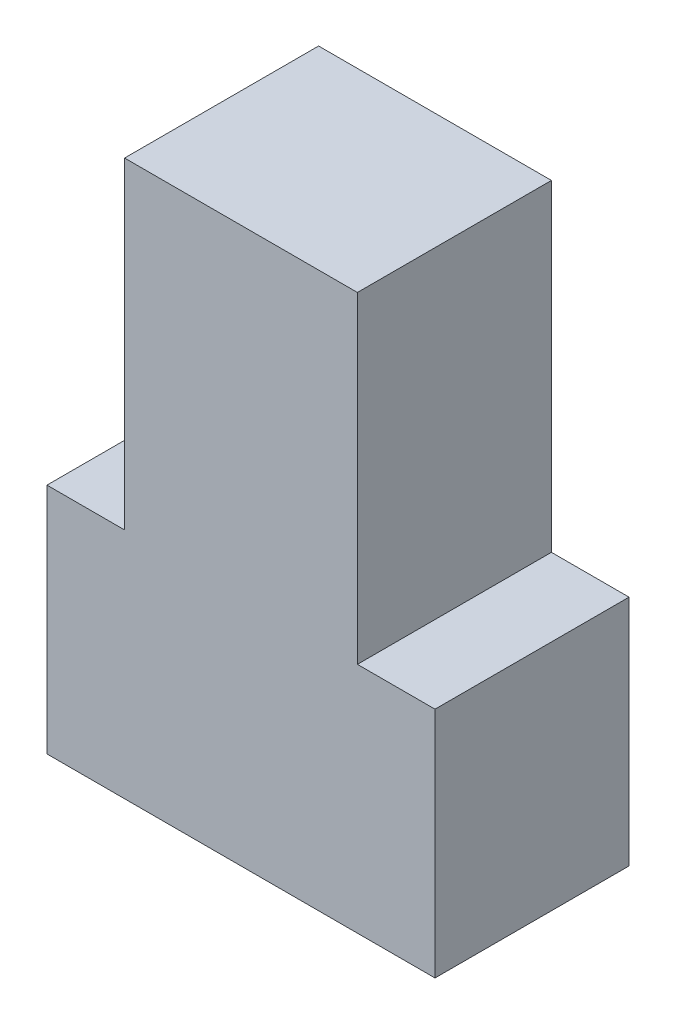
ISO-10303-21;
HEADER;
FILE_DESCRIPTION(('STEP AP214'),'2;1');
FILE_NAME('part.step','',(''),(''),'','','');
FILE_SCHEMA(('AUTOMOTIVE_DESIGN { 1 0 10303 214 1 1 1 1 }'));
ENDSEC;
DATA;
#1=APPLICATION_CONTEXT('core data for automotive mechanical design processes');
#2=APPLICATION_PROTOCOL_DEFINITION('international standard','automotive_design',2000,#1);
#3=PRODUCT_CONTEXT('',#1,'mechanical');
#4=PRODUCT('Part','Part','',(#3));
#5=PRODUCT_RELATED_PRODUCT_CATEGORY('part','',(#4));
#6=PRODUCT_DEFINITION_FORMATION('','',#4);
#7=PRODUCT_DEFINITION_CONTEXT('part definition',#1,'design');
#8=PRODUCT_DEFINITION('design','',#6,#7);
#9=PRODUCT_DEFINITION_SHAPE('','',#8);
#10=(LENGTH_UNIT() NAMED_UNIT(*) SI_UNIT(.MILLI.,.METRE.));
#11=(NAMED_UNIT(*) PLANE_ANGLE_UNIT() SI_UNIT($,.RADIAN.));
#12=(NAMED_UNIT(*) SI_UNIT($,.STERADIAN.) SOLID_ANGLE_UNIT());
#13=UNCERTAINTY_MEASURE_WITH_UNIT(LENGTH_MEASURE(1.E-05),#10,'distance_accuracy_value','');
#14=(GEOMETRIC_REPRESENTATION_CONTEXT(3) GLOBAL_UNCERTAINTY_ASSIGNED_CONTEXT((#13)) GLOBAL_UNIT_ASSIGNED_CONTEXT((#10,
#11,#12)) REPRESENTATION_CONTEXT('',''));
#15=CARTESIAN_POINT('',(0.,0.,0.));
#16=DIRECTION('',(0.,0.,1.));
#17=DIRECTION('',(1.,0.,0.));
#18=AXIS2_PLACEMENT_3D('',#15,#16,#17);
#19=CARTESIAN_POINT('',(-0.00029960835417188,20.4586796564352,-0.01));
#20=DIRECTION('',(0.,-1.,0.));
#21=DIRECTION('',(0.,0.,-1.));
#22=AXIS2_PLACEMENT_3D('',#19,#20,#21);
#23=PLANE('',#22);
#24=DIRECTION('',(1.,0.,0.));
#25=VECTOR('',#24,1.);
#26=CARTESIAN_POINT('',(0.,20.4586796564352,0.5));
#27=LINE('',#26,#25);
#28=CARTESIAN_POINT('',(32.0102996083547,20.4586796564352,0.5));
#29=VERTEX_POINT('',#28);
#30=CARTESIAN_POINT('',(32.6102996083546,20.4586796564352,0.5));
#31=VERTEX_POINT('',#30);
#32=EDGE_CURVE('E11',#29,#31,#27,.T.);
#33=ORIENTED_EDGE('',*,*,#32,.T.);
#34=DIRECTION('',(0.,0.,-1.));
#35=VECTOR('',#34,1.);
#36=CARTESIAN_POINT('',(32.6102996083546,20.4586796564352,0.5));
#37=LINE('',#36,#35);
#38=CARTESIAN_POINT('',(32.6102996083546,20.4586796564352,0.));
#39=VERTEX_POINT('',#38);
#40=EDGE_CURVE('E24',#31,#39,#37,.T.);
#41=ORIENTED_EDGE('',*,*,#40,.T.);
#42=DIRECTION('',(1.,0.,0.));
#43=VECTOR('',#42,1.);
#44=CARTESIAN_POINT('',(0.,20.4586796564352,0.));
#45=LINE('',#44,#43);
#46=CARTESIAN_POINT('',(32.0102996083547,20.4586796564352,0.));
#47=VERTEX_POINT('',#46);
#48=EDGE_CURVE('E143',#47,#39,#45,.T.);
#49=ORIENTED_EDGE('',*,*,#48,.F.);
#50=DIRECTION('',(0.,0.,1.));
#51=VECTOR('',#50,1.);
#52=CARTESIAN_POINT('',(32.0102996083547,20.4586796564352,0.5));
#53=LINE('',#52,#51);
#54=EDGE_CURVE('E141',#47,#29,#53,.T.);
#55=ORIENTED_EDGE('',*,*,#54,.T.);
#56=EDGE_LOOP('',(#33,#41,#49,#55));
#57=FACE_BOUND('',#56,.T.);
#58=ADVANCED_FACE('F17',(#57),#23,.F.);
#59=CARTESIAN_POINT('',(32.6102996083546,0.,0.5));
#60=DIRECTION('',(1.,0.,0.));
#61=DIRECTION('',(0.,0.,-1.));
#62=AXIS2_PLACEMENT_3D('',#59,#60,#61);
#63=PLANE('',#62);
#64=ORIENTED_EDGE('',*,*,#40,.F.);
#65=DIRECTION('',(0.,-1.,0.));
#66=VECTOR('',#65,1.);
#67=CARTESIAN_POINT('',(32.6102996083546,0.,0.5));
#68=LINE('',#67,#66);
#69=CARTESIAN_POINT('',(32.6102996083546,19.6286796574368,0.5));
#70=VERTEX_POINT('',#69);
#71=EDGE_CURVE('E139',#31,#70,#68,.T.);
#72=ORIENTED_EDGE('',*,*,#71,.T.);
#73=DIRECTION('',(0.,0.,-1.));
#74=VECTOR('',#73,1.);
#75=CARTESIAN_POINT('',(32.6102996083546,19.6286796574368,0.5));
#76=LINE('',#75,#74);
#77=CARTESIAN_POINT('',(32.6102996083546,19.6286796574368,0.));
#78=VERTEX_POINT('',#77);
#79=EDGE_CURVE('E94',#70,#78,#76,.T.);
#80=ORIENTED_EDGE('',*,*,#79,.T.);
#81=DIRECTION('',(0.,-1.,0.));
#82=VECTOR('',#81,1.);
#83=CARTESIAN_POINT('',(32.6102996083546,0.,0.));
#84=LINE('',#83,#82);
#85=EDGE_CURVE('E135',#39,#78,#84,.T.);
#86=ORIENTED_EDGE('',*,*,#85,.F.);
#87=EDGE_LOOP('',(#64,#72,#80,#86));
#88=FACE_BOUND('',#87,.T.);
#89=ADVANCED_FACE('F150',(#88),#63,.T.);
#90=CARTESIAN_POINT('',(0.,0.,0.));
#91=DIRECTION('',(0.,0.,1.));
#92=DIRECTION('',(1.,0.,0.));
#93=AXIS2_PLACEMENT_3D('',#90,#91,#92);
#94=PLANE('',#93);
#95=DIRECTION('',(0.,1.,0.));
#96=VECTOR('',#95,1.);
#97=CARTESIAN_POINT('',(32.0102996083547,0.,0.));
#98=LINE('',#97,#96);
#99=CARTESIAN_POINT('',(32.0102996083547,19.6286796574368,0.));
#100=VERTEX_POINT('',#99);
#101=EDGE_CURVE('E132',#100,#47,#98,.T.);
#102=ORIENTED_EDGE('',*,*,#101,.T.);
#103=ORIENTED_EDGE('',*,*,#48,.T.);
#104=ORIENTED_EDGE('',*,*,#85,.T.);
#105=DIRECTION('',(1.,0.,0.));
#106=VECTOR('',#105,1.);
#107=CARTESIAN_POINT('',(0.,19.6286796574368,0.));
#108=LINE('',#107,#106);
#109=CARTESIAN_POINT('',(32.8102996083546,19.6286796574368,0.));
#110=VERTEX_POINT('',#109);
#111=EDGE_CURVE('E130',#78,#110,#108,.T.);
#112=ORIENTED_EDGE('',*,*,#111,.T.);
#113=DIRECTION('',(0.,-1.,0.));
#114=VECTOR('',#113,1.);
#115=CARTESIAN_POINT('',(32.8102996083546,0.,0.));
#116=LINE('',#115,#114);
#117=CARTESIAN_POINT('',(32.8102996083546,19.0286796574368,0.));
#118=VERTEX_POINT('',#117);
#119=EDGE_CURVE('E99',#110,#118,#116,.T.);
#120=ORIENTED_EDGE('',*,*,#119,.T.);
#121=DIRECTION('',(-1.,0.,0.));
#122=VECTOR('',#121,1.);
#123=CARTESIAN_POINT('',(0.,19.0286796574368,0.));
#124=LINE('',#123,#122);
#125=CARTESIAN_POINT('',(31.8102996083547,19.0286796574368,0.));
#126=VERTEX_POINT('',#125);
#127=EDGE_CURVE('E127',#118,#126,#124,.T.);
#128=ORIENTED_EDGE('',*,*,#127,.T.);
#129=DIRECTION('',(0.,1.,0.));
#130=VECTOR('',#129,1.);
#131=CARTESIAN_POINT('',(31.8102996083547,0.,0.));
#132=LINE('',#131,#130);
#133=CARTESIAN_POINT('',(31.8102996083547,19.6286796574368,0.));
#134=VERTEX_POINT('',#133);
#135=EDGE_CURVE('E125',#126,#134,#132,.T.);
#136=ORIENTED_EDGE('',*,*,#135,.T.);
#137=DIRECTION('',(1.,0.,0.));
#138=VECTOR('',#137,1.);
#139=CARTESIAN_POINT('',(0.,19.6286796574368,0.));
#140=LINE('',#139,#138);
#141=EDGE_CURVE('E122',#134,#100,#140,.T.);
#142=ORIENTED_EDGE('',*,*,#141,.T.);
#143=EDGE_LOOP('',(#102,#103,#104,#112,#120,#128,#136,#142));
#144=FACE_BOUND('',#143,.T.);
#145=ADVANCED_FACE('F149',(#144),#94,.F.);
#146=CARTESIAN_POINT('',(32.0102996083547,0.,0.5));
#147=DIRECTION('',(-1.,0.,0.));
#148=DIRECTION('',(0.,0.,1.));
#149=AXIS2_PLACEMENT_3D('',#146,#147,#148);
#150=PLANE('',#149);
#151=ORIENTED_EDGE('',*,*,#54,.F.);
#152=ORIENTED_EDGE('',*,*,#101,.F.);
#153=DIRECTION('',(0.,0.,-1.));
#154=VECTOR('',#153,1.);
#155=CARTESIAN_POINT('',(32.0102996083547,19.6286796574368,0.5));
#156=LINE('',#155,#154);
#157=CARTESIAN_POINT('',(32.0102996083547,19.6286796574368,0.5));
#158=VERTEX_POINT('',#157);
#159=EDGE_CURVE('E119',#158,#100,#156,.T.);
#160=ORIENTED_EDGE('',*,*,#159,.F.);
#161=DIRECTION('',(0.,1.,0.));
#162=VECTOR('',#161,1.);
#163=CARTESIAN_POINT('',(32.0102996083547,0.,0.5));
#164=LINE('',#163,#162);
#165=EDGE_CURVE('E116',#158,#29,#164,.T.);
#166=ORIENTED_EDGE('',*,*,#165,.T.);
#167=EDGE_LOOP('',(#151,#152,#160,#166));
#168=FACE_BOUND('',#167,.T.);
#169=ADVANCED_FACE('F157',(#168),#150,.T.);
#170=CARTESIAN_POINT('',(0.,0.,0.5));
#171=DIRECTION('',(0.,0.,1.));
#172=DIRECTION('',(1.,0.,0.));
#173=AXIS2_PLACEMENT_3D('',#170,#171,#172);
#174=PLANE('',#173);
#175=ORIENTED_EDGE('',*,*,#32,.F.);
#176=ORIENTED_EDGE('',*,*,#165,.F.);
#177=DIRECTION('',(1.,0.,0.));
#178=VECTOR('',#177,1.);
#179=CARTESIAN_POINT('',(0.,19.6286796574368,0.5));
#180=LINE('',#179,#178);
#181=CARTESIAN_POINT('',(31.8102996083547,19.6286796574368,0.5));
#182=VERTEX_POINT('',#181);
#183=EDGE_CURVE('E113',#182,#158,#180,.T.);
#184=ORIENTED_EDGE('',*,*,#183,.F.);
#185=DIRECTION('',(0.,1.,0.));
#186=VECTOR('',#185,1.);
#187=CARTESIAN_POINT('',(31.8102996083547,0.,0.5));
#188=LINE('',#187,#186);
#189=CARTESIAN_POINT('',(31.8102996083547,19.0286796574368,0.5));
#190=VERTEX_POINT('',#189);
#191=EDGE_CURVE('E110',#190,#182,#188,.T.);
#192=ORIENTED_EDGE('',*,*,#191,.F.);
#193=DIRECTION('',(-1.,0.,0.));
#194=VECTOR('',#193,1.);
#195=CARTESIAN_POINT('',(0.,19.0286796574368,0.5));
#196=LINE('',#195,#194);
#197=CARTESIAN_POINT('',(32.8102996083546,19.0286796574368,0.5));
#198=VERTEX_POINT('',#197);
#199=EDGE_CURVE('E82',#198,#190,#196,.T.);
#200=ORIENTED_EDGE('',*,*,#199,.F.);
#201=DIRECTION('',(0.,-1.,0.));
#202=VECTOR('',#201,1.);
#203=CARTESIAN_POINT('',(32.8102996083546,0.,0.5));
#204=LINE('',#203,#202);
#205=CARTESIAN_POINT('',(32.8102996083546,19.6286796574368,0.5));
#206=VERTEX_POINT('',#205);
#207=EDGE_CURVE('E77',#206,#198,#204,.T.);
#208=ORIENTED_EDGE('',*,*,#207,.F.);
#209=DIRECTION('',(1.,0.,0.));
#210=VECTOR('',#209,1.);
#211=CARTESIAN_POINT('',(0.,19.6286796574368,0.5));
#212=LINE('',#211,#210);
#213=EDGE_CURVE('E80',#70,#206,#212,.T.);
#214=ORIENTED_EDGE('',*,*,#213,.F.);
#215=ORIENTED_EDGE('',*,*,#71,.F.);
#216=EDGE_LOOP('',(#175,#176,#184,#192,#200,#208,#214,#215));
#217=FACE_BOUND('',#216,.T.);
#218=ADVANCED_FACE('F79',(#217),#174,.T.);
#219=CARTESIAN_POINT('',(0.,19.6286796574368,0.5));
#220=DIRECTION('',(0.,1.,0.));
#221=DIRECTION('',(0.,0.,1.));
#222=AXIS2_PLACEMENT_3D('',#219,#220,#221);
#223=PLANE('',#222);
#224=ORIENTED_EDGE('',*,*,#141,.F.);
#225=DIRECTION('',(0.,0.,-1.));
#226=VECTOR('',#225,1.);
#227=CARTESIAN_POINT('',(31.8102996083547,19.6286796574368,0.5));
#228=LINE('',#227,#226);
#229=EDGE_CURVE('E95',#182,#134,#228,.T.);
#230=ORIENTED_EDGE('',*,*,#229,.F.);
#231=ORIENTED_EDGE('',*,*,#183,.T.);
#232=ORIENTED_EDGE('',*,*,#159,.T.);
#233=EDGE_LOOP('',(#224,#230,#231,#232));
#234=FACE_BOUND('',#233,.T.);
#235=ADVANCED_FACE('F165',(#234),#223,.T.);
#236=CARTESIAN_POINT('',(31.8102996083547,0.,0.5));
#237=DIRECTION('',(-1.,0.,0.));
#238=DIRECTION('',(0.,0.,1.));
#239=AXIS2_PLACEMENT_3D('',#236,#237,#238);
#240=PLANE('',#239);
#241=ORIENTED_EDGE('',*,*,#135,.F.);
#242=DIRECTION('',(0.,0.,-1.));
#243=VECTOR('',#242,1.);
#244=CARTESIAN_POINT('',(31.8102996083547,19.0286796574368,0.5));
#245=LINE('',#244,#243);
#246=EDGE_CURVE('E102',#190,#126,#245,.T.);
#247=ORIENTED_EDGE('',*,*,#246,.F.);
#248=ORIENTED_EDGE('',*,*,#191,.T.);
#249=ORIENTED_EDGE('',*,*,#229,.T.);
#250=EDGE_LOOP('',(#241,#247,#248,#249));
#251=FACE_BOUND('',#250,.T.);
#252=ADVANCED_FACE('F168',(#251),#240,.T.);
#253=CARTESIAN_POINT('',(0.,19.0286796574368,0.5));
#254=DIRECTION('',(0.,-1.,0.));
#255=DIRECTION('',(0.,0.,-1.));
#256=AXIS2_PLACEMENT_3D('',#253,#254,#255);
#257=PLANE('',#256);
#258=ORIENTED_EDGE('',*,*,#127,.F.);
#259=DIRECTION('',(0.,0.,-1.));
#260=VECTOR('',#259,1.);
#261=CARTESIAN_POINT('',(32.8102996083546,19.0286796574368,0.5));
#262=LINE('',#261,#260);
#263=EDGE_CURVE('E100',#198,#118,#262,.T.);
#264=ORIENTED_EDGE('',*,*,#263,.F.);
#265=ORIENTED_EDGE('',*,*,#199,.T.);
#266=ORIENTED_EDGE('',*,*,#246,.T.);
#267=EDGE_LOOP('',(#258,#264,#265,#266));
#268=FACE_BOUND('',#267,.T.);
#269=ADVANCED_FACE('F172',(#268),#257,.T.);
#270=CARTESIAN_POINT('',(32.8102996083546,0.,0.5));
#271=DIRECTION('',(1.,0.,0.));
#272=DIRECTION('',(0.,0.,-1.));
#273=AXIS2_PLACEMENT_3D('',#270,#271,#272);
#274=PLANE('',#273);
#275=ORIENTED_EDGE('',*,*,#119,.F.);
#276=DIRECTION('',(0.,0.,-1.));
#277=VECTOR('',#276,1.);
#278=CARTESIAN_POINT('',(32.8102996083546,19.6286796574368,0.5));
#279=LINE('',#278,#277);
#280=EDGE_CURVE('E93',#206,#110,#279,.T.);
#281=ORIENTED_EDGE('',*,*,#280,.F.);
#282=ORIENTED_EDGE('',*,*,#207,.T.);
#283=ORIENTED_EDGE('',*,*,#263,.T.);
#284=EDGE_LOOP('',(#275,#281,#282,#283));
#285=FACE_BOUND('',#284,.T.);
#286=ADVANCED_FACE('F98',(#285),#274,.T.);
#287=CARTESIAN_POINT('',(0.,19.6286796574368,0.5));
#288=DIRECTION('',(0.,1.,0.));
#289=DIRECTION('',(0.,0.,1.));
#290=AXIS2_PLACEMENT_3D('',#287,#288,#289);
#291=PLANE('',#290);
#292=ORIENTED_EDGE('',*,*,#111,.F.);
#293=ORIENTED_EDGE('',*,*,#79,.F.);
#294=ORIENTED_EDGE('',*,*,#213,.T.);
#295=ORIENTED_EDGE('',*,*,#280,.T.);
#296=EDGE_LOOP('',(#292,#293,#294,#295));
#297=FACE_BOUND('',#296,.T.);
#298=ADVANCED_FACE('F92',(#297),#291,.T.);
#299=CLOSED_SHELL('',(#58,#89,#145,#169,#218,#235,#252,#269,#286,#298));
#300=MANIFOLD_SOLID_BREP('B1',#299);
#301=ADVANCED_BREP_SHAPE_REPRESENTATION('',(#18,#300),#14);
#302=SHAPE_DEFINITION_REPRESENTATION(#9,#301);
ENDSEC;
END-ISO-10303-21;
